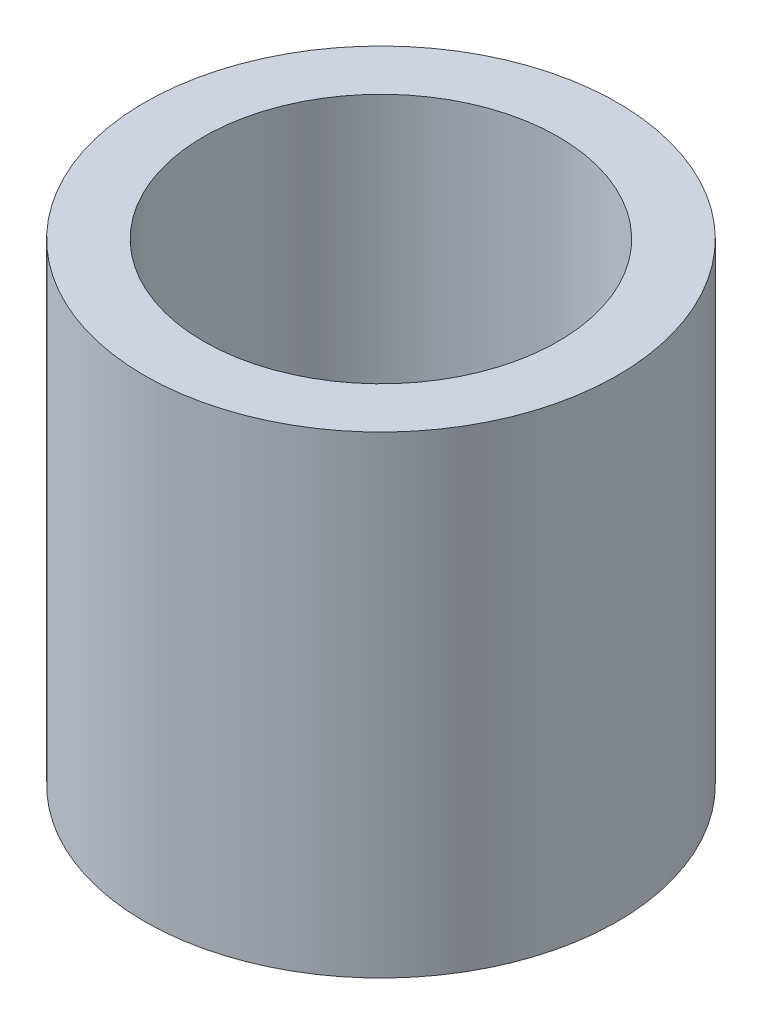
ISO-10303-21;
HEADER;
FILE_DESCRIPTION(('STEP AP214'),'2;1');
FILE_NAME('part.step','',(''),(''),'','','');
FILE_SCHEMA(('AUTOMOTIVE_DESIGN { 1 0 10303 214 1 1 1 1 }'));
ENDSEC;
DATA;
#1=APPLICATION_CONTEXT('core data for automotive mechanical design processes');
#2=APPLICATION_PROTOCOL_DEFINITION('international standard','automotive_design',2000,#1);
#3=PRODUCT_CONTEXT('',#1,'mechanical');
#4=PRODUCT('Part','Part','',(#3));
#5=PRODUCT_RELATED_PRODUCT_CATEGORY('part','',(#4));
#6=PRODUCT_DEFINITION_FORMATION('','',#4);
#7=PRODUCT_DEFINITION_CONTEXT('part definition',#1,'design');
#8=PRODUCT_DEFINITION('design','',#6,#7);
#9=PRODUCT_DEFINITION_SHAPE('','',#8);
#10=(LENGTH_UNIT() NAMED_UNIT(*) SI_UNIT(.MILLI.,.METRE.));
#11=(NAMED_UNIT(*) PLANE_ANGLE_UNIT() SI_UNIT($,.RADIAN.));
#12=(NAMED_UNIT(*) SI_UNIT($,.STERADIAN.) SOLID_ANGLE_UNIT());
#13=UNCERTAINTY_MEASURE_WITH_UNIT(LENGTH_MEASURE(1.E-05),#10,'distance_accuracy_value','');
#14=(GEOMETRIC_REPRESENTATION_CONTEXT(3) GLOBAL_UNCERTAINTY_ASSIGNED_CONTEXT((#13)) GLOBAL_UNIT_ASSIGNED_CONTEXT((#10,
#11,#12)) REPRESENTATION_CONTEXT('',''));
#15=CARTESIAN_POINT('',(0.,0.,0.));
#16=DIRECTION('',(0.,0.,1.));
#17=DIRECTION('',(1.,0.,0.));
#18=AXIS2_PLACEMENT_3D('',#15,#16,#17);
#19=CARTESIAN_POINT('',(0.,25.4,0.));
#20=DIRECTION('',(0.,-1.,0.));
#21=DIRECTION('',(0.,0.,-1.));
#22=AXIS2_PLACEMENT_3D('',#19,#20,#21);
#23=CYLINDRICAL_SURFACE('',#22,12.7);
#24=CARTESIAN_POINT('',(0.,25.4,0.));
#25=DIRECTION('',(0.,1.,0.));
#26=DIRECTION('',(0.,0.,1.));
#27=AXIS2_PLACEMENT_3D('',#24,#25,#26);
#28=CIRCLE('',#27,12.7);
#29=CARTESIAN_POINT('',(0.,25.4,12.7));
#30=VERTEX_POINT('',#29);
#31=EDGE_CURVE('E10',#30,#30,#28,.T.);
#32=ORIENTED_EDGE('',*,*,#31,.F.);
#33=EDGE_LOOP('',(#32));
#34=FACE_BOUND('',#33,.T.);
#35=CARTESIAN_POINT('',(0.,0.,0.));
#36=DIRECTION('',(0.,1.,0.));
#37=DIRECTION('',(0.,0.,1.));
#38=AXIS2_PLACEMENT_3D('',#35,#36,#37);
#39=CIRCLE('',#38,12.7);
#40=CARTESIAN_POINT('',(0.,0.,12.7));
#41=VERTEX_POINT('',#40);
#42=EDGE_CURVE('E38',#41,#41,#39,.T.);
#43=ORIENTED_EDGE('',*,*,#42,.T.);
#44=EDGE_LOOP('',(#43));
#45=FACE_BOUND('',#44,.T.);
#46=ADVANCED_FACE('F35',(#34,#45),#23,.T.);
#47=CARTESIAN_POINT('',(0.,25.4,0.));
#48=DIRECTION('',(0.,1.,0.));
#49=DIRECTION('',(0.,0.,1.));
#50=AXIS2_PLACEMENT_3D('',#47,#48,#49);
#51=PLANE('',#50);
#52=CARTESIAN_POINT('',(0.,25.4,0.));
#53=DIRECTION('',(0.,1.,0.));
#54=DIRECTION('',(0.,0.,1.));
#55=AXIS2_PLACEMENT_3D('',#52,#53,#54);
#56=CIRCLE('',#55,9.525);
#57=CARTESIAN_POINT('',(0.,25.4,9.525));
#58=VERTEX_POINT('',#57);
#59=EDGE_CURVE('E47',#58,#58,#56,.T.);
#60=ORIENTED_EDGE('',*,*,#59,.F.);
#61=EDGE_LOOP('',(#60));
#62=FACE_BOUND('',#61,.T.);
#63=ORIENTED_EDGE('',*,*,#31,.T.);
#64=EDGE_LOOP('',(#63));
#65=FACE_BOUND('',#64,.T.);
#66=ADVANCED_FACE('F80',(#62,#65),#51,.T.);
#67=CARTESIAN_POINT('',(0.,0.,0.));
#68=DIRECTION('',(0.,1.,0.));
#69=DIRECTION('',(0.,0.,1.));
#70=AXIS2_PLACEMENT_3D('',#67,#68,#69);
#71=PLANE('',#70);
#72=CARTESIAN_POINT('',(0.,0.,0.));
#73=DIRECTION('',(0.,1.,0.));
#74=DIRECTION('',(0.,0.,1.));
#75=AXIS2_PLACEMENT_3D('',#72,#73,#74);
#76=CIRCLE('',#75,2.54);
#77=CARTESIAN_POINT('',(0.,0.,2.54));
#78=VERTEX_POINT('',#77);
#79=EDGE_CURVE('E50',#78,#78,#76,.T.);
#80=ORIENTED_EDGE('',*,*,#79,.T.);
#81=EDGE_LOOP('',(#80));
#82=FACE_BOUND('',#81,.T.);
#83=ORIENTED_EDGE('',*,*,#42,.F.);
#84=EDGE_LOOP('',(#83));
#85=FACE_BOUND('',#84,.T.);
#86=ADVANCED_FACE('F59',(#82,#85),#71,.F.);
#87=CARTESIAN_POINT('',(0.,3.175,0.));
#88=DIRECTION('',(0.,1.,0.));
#89=DIRECTION('',(0.,0.,1.));
#90=AXIS2_PLACEMENT_3D('',#87,#88,#89);
#91=CYLINDRICAL_SURFACE('',#90,9.525);
#92=CARTESIAN_POINT('',(0.,3.175,0.));
#93=DIRECTION('',(0.,1.,0.));
#94=DIRECTION('',(0.,0.,1.));
#95=AXIS2_PLACEMENT_3D('',#92,#93,#94);
#96=CIRCLE('',#95,9.525);
#97=CARTESIAN_POINT('',(0.,3.175,9.525));
#98=VERTEX_POINT('',#97);
#99=EDGE_CURVE('E45',#98,#98,#96,.T.);
#100=ORIENTED_EDGE('',*,*,#99,.F.);
#101=EDGE_LOOP('',(#100));
#102=FACE_BOUND('',#101,.T.);
#103=ORIENTED_EDGE('',*,*,#59,.T.);
#104=EDGE_LOOP('',(#103));
#105=FACE_BOUND('',#104,.T.);
#106=ADVANCED_FACE('F71',(#102,#105),#91,.F.);
#107=CARTESIAN_POINT('',(0.,3.175,0.));
#108=DIRECTION('',(0.,1.,0.));
#109=DIRECTION('',(0.,0.,1.));
#110=AXIS2_PLACEMENT_3D('',#107,#108,#109);
#111=PLANE('',#110);
#112=CARTESIAN_POINT('',(0.,3.175,0.));
#113=DIRECTION('',(0.,1.,0.));
#114=DIRECTION('',(0.,0.,1.));
#115=AXIS2_PLACEMENT_3D('',#112,#113,#114);
#116=CIRCLE('',#115,2.54);
#117=CARTESIAN_POINT('',(0.,3.175,2.54));
#118=VERTEX_POINT('',#117);
#119=EDGE_CURVE('E53',#118,#118,#116,.T.);
#120=ORIENTED_EDGE('',*,*,#119,.F.);
#121=EDGE_LOOP('',(#120));
#122=FACE_BOUND('',#121,.T.);
#123=ORIENTED_EDGE('',*,*,#99,.T.);
#124=EDGE_LOOP('',(#123));
#125=FACE_BOUND('',#124,.T.);
#126=ADVANCED_FACE('F65',(#122,#125),#111,.T.);
#127=CARTESIAN_POINT('',(0.,0.,0.));
#128=DIRECTION('',(0.,1.,0.));
#129=DIRECTION('',(0.,0.,1.));
#130=AXIS2_PLACEMENT_3D('',#127,#128,#129);
#131=CYLINDRICAL_SURFACE('',#130,2.54);
#132=ORIENTED_EDGE('',*,*,#79,.F.);
#133=EDGE_LOOP('',(#132));
#134=FACE_BOUND('',#133,.T.);
#135=ORIENTED_EDGE('',*,*,#119,.T.);
#136=EDGE_LOOP('',(#135));
#137=FACE_BOUND('',#136,.T.);
#138=ADVANCED_FACE('F62',(#134,#137),#131,.F.);
#139=CLOSED_SHELL('',(#46,#66,#86,#106,#126,#138));
#140=MANIFOLD_SOLID_BREP('B2',#139);
#141=ADVANCED_BREP_SHAPE_REPRESENTATION('',(#18,#140),#14);
#142=SHAPE_DEFINITION_REPRESENTATION(#9,#141);
ENDSEC;
END-ISO-10303-21;
